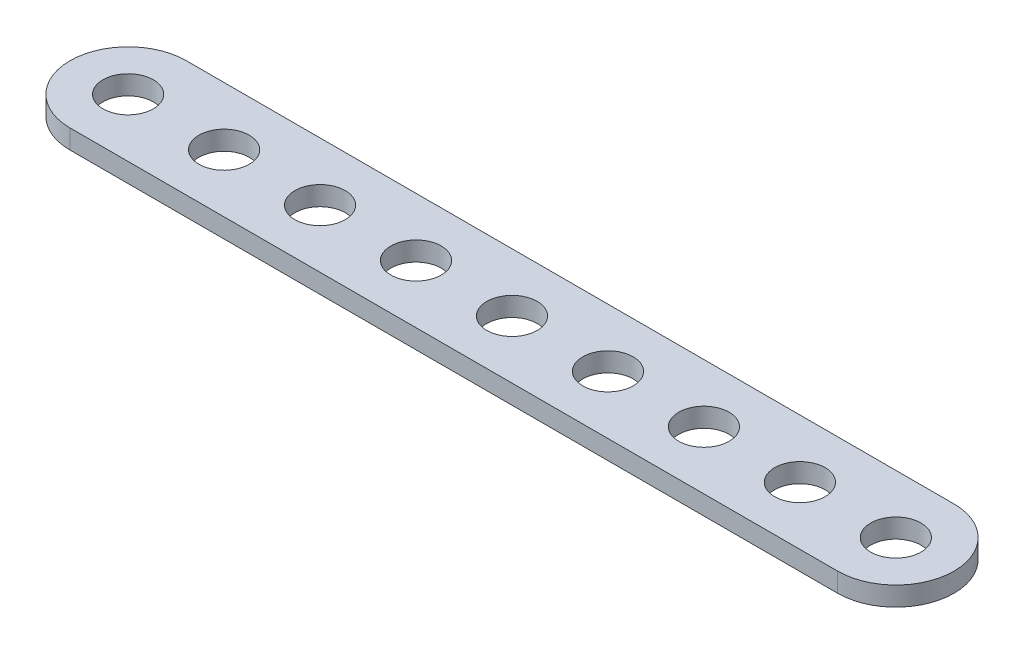
ISO-10303-21;
HEADER;
FILE_DESCRIPTION(('STEP AP214'),'2;1');
FILE_NAME('part.step','',(''),(''),'','','');
FILE_SCHEMA(('AUTOMOTIVE_DESIGN { 1 0 10303 214 1 1 1 1 }'));
ENDSEC;
DATA;
#1=APPLICATION_CONTEXT('core data for automotive mechanical design processes');
#2=APPLICATION_PROTOCOL_DEFINITION('international standard','automotive_design',2000,#1);
#3=PRODUCT_CONTEXT('',#1,'mechanical');
#4=PRODUCT('Part','Part','',(#3));
#5=PRODUCT_RELATED_PRODUCT_CATEGORY('part','',(#4));
#6=PRODUCT_DEFINITION_FORMATION('','',#4);
#7=PRODUCT_DEFINITION_CONTEXT('part definition',#1,'design');
#8=PRODUCT_DEFINITION('design','',#6,#7);
#9=PRODUCT_DEFINITION_SHAPE('','',#8);
#10=(LENGTH_UNIT() NAMED_UNIT(*) SI_UNIT(.MILLI.,.METRE.));
#11=(NAMED_UNIT(*) PLANE_ANGLE_UNIT() SI_UNIT($,.RADIAN.));
#12=(NAMED_UNIT(*) SI_UNIT($,.STERADIAN.) SOLID_ANGLE_UNIT());
#13=UNCERTAINTY_MEASURE_WITH_UNIT(LENGTH_MEASURE(1.E-05),#10,'distance_accuracy_value','');
#14=(GEOMETRIC_REPRESENTATION_CONTEXT(3) GLOBAL_UNCERTAINTY_ASSIGNED_CONTEXT((#13)) GLOBAL_UNIT_ASSIGNED_CONTEXT((#10,
#11,#12)) REPRESENTATION_CONTEXT('',''));
#15=CARTESIAN_POINT('',(0.,0.,0.));
#16=DIRECTION('',(0.,0.,1.));
#17=DIRECTION('',(1.,0.,0.));
#18=AXIS2_PLACEMENT_3D('',#15,#16,#17);
#19=CARTESIAN_POINT('',(0.,0.,0.));
#20=DIRECTION('',(0.,1.,0.));
#21=DIRECTION('',(0.,0.,1.));
#22=AXIS2_PLACEMENT_3D('',#19,#20,#21);
#23=PLANE('',#22);
#24=CARTESIAN_POINT('',(64.,0.,0.));
#25=DIRECTION('',(0.,-1.,0.));
#26=DIRECTION('',(0.,0.,-1.));
#27=AXIS2_PLACEMENT_3D('',#24,#25,#26);
#28=CIRCLE('',#27,4.85);
#29=CARTESIAN_POINT('',(64.,0.,4.85));
#30=VERTEX_POINT('',#29);
#31=CARTESIAN_POINT('',(64.,0.,-4.85));
#32=VERTEX_POINT('',#31);
#33=EDGE_CURVE('E55',#30,#32,#28,.F.);
#34=ORIENTED_EDGE('',*,*,#33,.F.);
#35=DIRECTION('',(-1.,0.,0.));
#36=VECTOR('',#35,1.);
#37=CARTESIAN_POINT('',(0.,0.,4.85));
#38=LINE('',#37,#36);
#39=CARTESIAN_POINT('',(0.,0.,4.85));
#40=VERTEX_POINT('',#39);
#41=EDGE_CURVE('E60',#30,#40,#38,.T.);
#42=ORIENTED_EDGE('',*,*,#41,.T.);
#43=CARTESIAN_POINT('',(0.,0.,0.));
#44=DIRECTION('',(0.,-1.,0.));
#45=DIRECTION('',(0.,0.,-1.));
#46=AXIS2_PLACEMENT_3D('',#43,#44,#45);
#47=CIRCLE('',#46,4.85);
#48=CARTESIAN_POINT('',(0.,0.,-4.85));
#49=VERTEX_POINT('',#48);
#50=EDGE_CURVE('E76',#49,#40,#47,.F.);
#51=ORIENTED_EDGE('',*,*,#50,.F.);
#52=DIRECTION('',(1.,0.,0.));
#53=VECTOR('',#52,1.);
#54=CARTESIAN_POINT('',(0.,0.,-4.85));
#55=LINE('',#54,#53);
#56=EDGE_CURVE('E61',#49,#32,#55,.T.);
#57=ORIENTED_EDGE('',*,*,#56,.T.);
#58=EDGE_LOOP('',(#34,#42,#51,#57));
#59=FACE_BOUND('',#58,.T.);
#60=CARTESIAN_POINT('',(0.,0.,0.));
#61=DIRECTION('',(0.,-1.,0.));
#62=DIRECTION('',(0.,0.,-1.));
#63=AXIS2_PLACEMENT_3D('',#60,#61,#62);
#64=CIRCLE('',#63,2.1);
#65=CARTESIAN_POINT('',(0.,0.,-2.1));
#66=VERTEX_POINT('',#65);
#67=EDGE_CURVE('E64',#66,#66,#64,.F.);
#68=ORIENTED_EDGE('',*,*,#67,.T.);
#69=EDGE_LOOP('',(#68));
#70=FACE_BOUND('',#69,.T.);
#71=CARTESIAN_POINT('',(24.,0.,0.));
#72=DIRECTION('',(0.,-1.,0.));
#73=DIRECTION('',(0.,0.,-1.));
#74=AXIS2_PLACEMENT_3D('',#71,#72,#73);
#75=CIRCLE('',#74,2.1);
#76=CARTESIAN_POINT('',(24.,0.,-2.1));
#77=VERTEX_POINT('',#76);
#78=EDGE_CURVE('E73',#77,#77,#75,.F.);
#79=ORIENTED_EDGE('',*,*,#78,.T.);
#80=EDGE_LOOP('',(#79));
#81=FACE_BOUND('',#80,.T.);
#82=CARTESIAN_POINT('',(8.,0.,0.));
#83=DIRECTION('',(0.,-1.,0.));
#84=DIRECTION('',(0.,0.,-1.));
#85=AXIS2_PLACEMENT_3D('',#82,#83,#84);
#86=CIRCLE('',#85,2.1);
#87=CARTESIAN_POINT('',(8.,0.,-2.1));
#88=VERTEX_POINT('',#87);
#89=EDGE_CURVE('E128',#88,#88,#86,.F.);
#90=ORIENTED_EDGE('',*,*,#89,.T.);
#91=EDGE_LOOP('',(#90));
#92=FACE_BOUND('',#91,.T.);
#93=CARTESIAN_POINT('',(16.,0.,0.));
#94=DIRECTION('',(0.,-1.,0.));
#95=DIRECTION('',(0.,0.,-1.));
#96=AXIS2_PLACEMENT_3D('',#93,#94,#95);
#97=CIRCLE('',#96,2.1);
#98=CARTESIAN_POINT('',(16.,0.,-2.1));
#99=VERTEX_POINT('',#98);
#100=EDGE_CURVE('E121',#99,#99,#97,.F.);
#101=ORIENTED_EDGE('',*,*,#100,.T.);
#102=EDGE_LOOP('',(#101));
#103=FACE_BOUND('',#102,.T.);
#104=CARTESIAN_POINT('',(32.,0.,0.));
#105=DIRECTION('',(0.,-1.,0.));
#106=DIRECTION('',(0.,0.,-1.));
#107=AXIS2_PLACEMENT_3D('',#104,#105,#106);
#108=CIRCLE('',#107,2.1);
#109=CARTESIAN_POINT('',(32.,0.,-2.1));
#110=VERTEX_POINT('',#109);
#111=EDGE_CURVE('E131',#110,#110,#108,.F.);
#112=ORIENTED_EDGE('',*,*,#111,.T.);
#113=EDGE_LOOP('',(#112));
#114=FACE_BOUND('',#113,.T.);
#115=CARTESIAN_POINT('',(40.,0.,0.));
#116=DIRECTION('',(0.,-1.,0.));
#117=DIRECTION('',(0.,0.,-1.));
#118=AXIS2_PLACEMENT_3D('',#115,#116,#117);
#119=CIRCLE('',#118,2.1);
#120=CARTESIAN_POINT('',(40.,0.,-2.1));
#121=VERTEX_POINT('',#120);
#122=EDGE_CURVE('E118',#121,#121,#119,.F.);
#123=ORIENTED_EDGE('',*,*,#122,.T.);
#124=EDGE_LOOP('',(#123));
#125=FACE_BOUND('',#124,.T.);
#126=CARTESIAN_POINT('',(48.,0.,0.));
#127=DIRECTION('',(0.,-1.,0.));
#128=DIRECTION('',(0.,0.,-1.));
#129=AXIS2_PLACEMENT_3D('',#126,#127,#128);
#130=CIRCLE('',#129,2.1);
#131=CARTESIAN_POINT('',(48.,0.,-2.1));
#132=VERTEX_POINT('',#131);
#133=EDGE_CURVE('E133',#132,#132,#130,.F.);
#134=ORIENTED_EDGE('',*,*,#133,.T.);
#135=EDGE_LOOP('',(#134));
#136=FACE_BOUND('',#135,.T.);
#137=CARTESIAN_POINT('',(56.,0.,0.));
#138=DIRECTION('',(0.,-1.,0.));
#139=DIRECTION('',(0.,0.,-1.));
#140=AXIS2_PLACEMENT_3D('',#137,#138,#139);
#141=CIRCLE('',#140,2.1);
#142=CARTESIAN_POINT('',(56.,0.,-2.1));
#143=VERTEX_POINT('',#142);
#144=EDGE_CURVE('E115',#143,#143,#141,.F.);
#145=ORIENTED_EDGE('',*,*,#144,.T.);
#146=EDGE_LOOP('',(#145));
#147=FACE_BOUND('',#146,.T.);
#148=CARTESIAN_POINT('',(64.,0.,0.));
#149=DIRECTION('',(0.,-1.,0.));
#150=DIRECTION('',(0.,0.,-1.));
#151=AXIS2_PLACEMENT_3D('',#148,#149,#150);
#152=CIRCLE('',#151,2.1);
#153=CARTESIAN_POINT('',(64.,0.,-2.1));
#154=VERTEX_POINT('',#153);
#155=EDGE_CURVE('E19',#154,#154,#152,.F.);
#156=ORIENTED_EDGE('',*,*,#155,.T.);
#157=EDGE_LOOP('',(#156));
#158=FACE_BOUND('',#157,.T.);
#159=ADVANCED_FACE('F16',(#59,#70,#81,#92,#103,#114,#125,#136,#147,#158),#23,.F.);
#160=CARTESIAN_POINT('',(64.,1.6,0.));
#161=DIRECTION('',(0.,-1.,0.));
#162=DIRECTION('',(0.,0.,-1.));
#163=AXIS2_PLACEMENT_3D('',#160,#161,#162);
#164=CYLINDRICAL_SURFACE('',#163,2.1);
#165=ORIENTED_EDGE('',*,*,#155,.F.);
#166=EDGE_LOOP('',(#165));
#167=FACE_BOUND('',#166,.T.);
#168=CARTESIAN_POINT('',(64.,1.6,0.));
#169=DIRECTION('',(0.,-1.,0.));
#170=DIRECTION('',(0.,0.,-1.));
#171=AXIS2_PLACEMENT_3D('',#168,#169,#170);
#172=CIRCLE('',#171,2.1);
#173=CARTESIAN_POINT('',(64.,1.6,-2.1));
#174=VERTEX_POINT('',#173);
#175=EDGE_CURVE('E112',#174,#174,#172,.T.);
#176=ORIENTED_EDGE('',*,*,#175,.F.);
#177=EDGE_LOOP('',(#176));
#178=FACE_BOUND('',#177,.T.);
#179=ADVANCED_FACE('F141',(#167,#178),#164,.F.);
#180=CARTESIAN_POINT('',(48.,1.6,0.));
#181=DIRECTION('',(0.,-1.,0.));
#182=DIRECTION('',(0.,0.,-1.));
#183=AXIS2_PLACEMENT_3D('',#180,#181,#182);
#184=CYLINDRICAL_SURFACE('',#183,2.1);
#185=ORIENTED_EDGE('',*,*,#133,.F.);
#186=EDGE_LOOP('',(#185));
#187=FACE_BOUND('',#186,.T.);
#188=CARTESIAN_POINT('',(48.,1.6,0.));
#189=DIRECTION('',(0.,-1.,0.));
#190=DIRECTION('',(0.,0.,-1.));
#191=AXIS2_PLACEMENT_3D('',#188,#189,#190);
#192=CIRCLE('',#191,2.1);
#193=CARTESIAN_POINT('',(48.,1.6,-2.1));
#194=VERTEX_POINT('',#193);
#195=EDGE_CURVE('E109',#194,#194,#192,.T.);
#196=ORIENTED_EDGE('',*,*,#195,.F.);
#197=EDGE_LOOP('',(#196));
#198=FACE_BOUND('',#197,.T.);
#199=ADVANCED_FACE('F144',(#187,#198),#184,.F.);
#200=CARTESIAN_POINT('',(32.,1.6,0.));
#201=DIRECTION('',(0.,-1.,0.));
#202=DIRECTION('',(0.,0.,-1.));
#203=AXIS2_PLACEMENT_3D('',#200,#201,#202);
#204=CYLINDRICAL_SURFACE('',#203,2.1);
#205=ORIENTED_EDGE('',*,*,#111,.F.);
#206=EDGE_LOOP('',(#205));
#207=FACE_BOUND('',#206,.T.);
#208=CARTESIAN_POINT('',(32.,1.6,0.));
#209=DIRECTION('',(0.,-1.,0.));
#210=DIRECTION('',(0.,0.,-1.));
#211=AXIS2_PLACEMENT_3D('',#208,#209,#210);
#212=CIRCLE('',#211,2.1);
#213=CARTESIAN_POINT('',(32.,1.6,-2.1));
#214=VERTEX_POINT('',#213);
#215=EDGE_CURVE('E106',#214,#214,#212,.T.);
#216=ORIENTED_EDGE('',*,*,#215,.F.);
#217=EDGE_LOOP('',(#216));
#218=FACE_BOUND('',#217,.T.);
#219=ADVANCED_FACE('F190',(#207,#218),#204,.F.);
#220=CARTESIAN_POINT('',(8.,1.6,0.));
#221=DIRECTION('',(0.,-1.,0.));
#222=DIRECTION('',(0.,0.,-1.));
#223=AXIS2_PLACEMENT_3D('',#220,#221,#222);
#224=CYLINDRICAL_SURFACE('',#223,2.1);
#225=ORIENTED_EDGE('',*,*,#89,.F.);
#226=EDGE_LOOP('',(#225));
#227=FACE_BOUND('',#226,.T.);
#228=CARTESIAN_POINT('',(8.,1.6,0.));
#229=DIRECTION('',(0.,-1.,0.));
#230=DIRECTION('',(0.,0.,-1.));
#231=AXIS2_PLACEMENT_3D('',#228,#229,#230);
#232=CIRCLE('',#231,2.1);
#233=CARTESIAN_POINT('',(8.,1.6,-2.1));
#234=VERTEX_POINT('',#233);
#235=EDGE_CURVE('E103',#234,#234,#232,.T.);
#236=ORIENTED_EDGE('',*,*,#235,.F.);
#237=EDGE_LOOP('',(#236));
#238=FACE_BOUND('',#237,.T.);
#239=ADVANCED_FACE('F186',(#227,#238),#224,.F.);
#240=CARTESIAN_POINT('',(0.,1.6,0.));
#241=DIRECTION('',(0.,-1.,0.));
#242=DIRECTION('',(0.,0.,-1.));
#243=AXIS2_PLACEMENT_3D('',#240,#241,#242);
#244=CYLINDRICAL_SURFACE('',#243,2.1);
#245=ORIENTED_EDGE('',*,*,#67,.F.);
#246=EDGE_LOOP('',(#245));
#247=FACE_BOUND('',#246,.T.);
#248=CARTESIAN_POINT('',(0.,1.6,0.));
#249=DIRECTION('',(0.,-1.,0.));
#250=DIRECTION('',(0.,0.,-1.));
#251=AXIS2_PLACEMENT_3D('',#248,#249,#250);
#252=CIRCLE('',#251,2.1);
#253=CARTESIAN_POINT('',(0.,1.6,-2.1));
#254=VERTEX_POINT('',#253);
#255=EDGE_CURVE('E100',#254,#254,#252,.T.);
#256=ORIENTED_EDGE('',*,*,#255,.F.);
#257=EDGE_LOOP('',(#256));
#258=FACE_BOUND('',#257,.T.);
#259=ADVANCED_FACE('F183',(#247,#258),#244,.F.);
#260=CARTESIAN_POINT('',(64.,1.6,0.));
#261=DIRECTION('',(0.,-1.,0.));
#262=DIRECTION('',(0.,0.,-1.));
#263=AXIS2_PLACEMENT_3D('',#260,#261,#262);
#264=CYLINDRICAL_SURFACE('',#263,4.85);
#265=ORIENTED_EDGE('',*,*,#33,.T.);
#266=DIRECTION('',(0.,1.,0.));
#267=VECTOR('',#266,1.);
#268=CARTESIAN_POINT('',(64.,1.6,-4.85));
#269=LINE('',#268,#267);
#270=CARTESIAN_POINT('',(64.,1.6,-4.85));
#271=VERTEX_POINT('',#270);
#272=EDGE_CURVE('E83',#32,#271,#269,.T.);
#273=ORIENTED_EDGE('',*,*,#272,.T.);
#274=CARTESIAN_POINT('',(64.,1.6,0.));
#275=DIRECTION('',(0.,-1.,0.));
#276=DIRECTION('',(0.,0.,-1.));
#277=AXIS2_PLACEMENT_3D('',#274,#275,#276);
#278=CIRCLE('',#277,4.85);
#279=CARTESIAN_POINT('',(64.,1.6,4.85));
#280=VERTEX_POINT('',#279);
#281=EDGE_CURVE('E70',#280,#271,#278,.F.);
#282=ORIENTED_EDGE('',*,*,#281,.F.);
#283=DIRECTION('',(0.,1.,0.));
#284=VECTOR('',#283,1.);
#285=CARTESIAN_POINT('',(64.,1.6,4.85));
#286=LINE('',#285,#284);
#287=EDGE_CURVE('E67',#280,#30,#286,.F.);
#288=ORIENTED_EDGE('',*,*,#287,.T.);
#289=EDGE_LOOP('',(#265,#273,#282,#288));
#290=FACE_BOUND('',#289,.T.);
#291=ADVANCED_FACE('F68',(#290),#264,.T.);
#292=CARTESIAN_POINT('',(0.,1.6,-4.85));
#293=DIRECTION('',(0.,0.,1.));
#294=DIRECTION('',(1.,0.,0.));
#295=AXIS2_PLACEMENT_3D('',#292,#293,#294);
#296=PLANE('',#295);
#297=DIRECTION('',(1.,0.,0.));
#298=VECTOR('',#297,1.);
#299=CARTESIAN_POINT('',(0.,1.6,-4.85));
#300=LINE('',#299,#298);
#301=CARTESIAN_POINT('',(0.,1.6,-4.85));
#302=VERTEX_POINT('',#301);
#303=EDGE_CURVE('E98',#271,#302,#300,.F.);
#304=ORIENTED_EDGE('',*,*,#303,.F.);
#305=ORIENTED_EDGE('',*,*,#272,.F.);
#306=ORIENTED_EDGE('',*,*,#56,.F.);
#307=DIRECTION('',(0.,-1.,0.));
#308=VECTOR('',#307,1.);
#309=CARTESIAN_POINT('',(0.,1.6,-4.85));
#310=LINE('',#309,#308);
#311=EDGE_CURVE('E79',#302,#49,#310,.T.);
#312=ORIENTED_EDGE('',*,*,#311,.F.);
#313=EDGE_LOOP('',(#304,#305,#306,#312));
#314=FACE_BOUND('',#313,.T.);
#315=ADVANCED_FACE('F177',(#314),#296,.F.);
#316=CARTESIAN_POINT('',(0.,1.6,0.));
#317=DIRECTION('',(0.,-1.,0.));
#318=DIRECTION('',(0.,0.,-1.));
#319=AXIS2_PLACEMENT_3D('',#316,#317,#318);
#320=CYLINDRICAL_SURFACE('',#319,4.85);
#321=ORIENTED_EDGE('',*,*,#50,.T.);
#322=DIRECTION('',(0.,1.,0.));
#323=VECTOR('',#322,1.);
#324=CARTESIAN_POINT('',(0.,1.6,4.85));
#325=LINE('',#324,#323);
#326=CARTESIAN_POINT('',(0.,1.6,4.85));
#327=VERTEX_POINT('',#326);
#328=EDGE_CURVE('E34',#40,#327,#325,.T.);
#329=ORIENTED_EDGE('',*,*,#328,.T.);
#330=CARTESIAN_POINT('',(0.,1.6,0.));
#331=DIRECTION('',(0.,-1.,0.));
#332=DIRECTION('',(0.,0.,-1.));
#333=AXIS2_PLACEMENT_3D('',#330,#331,#332);
#334=CIRCLE('',#333,4.85);
#335=EDGE_CURVE('E95',#302,#327,#334,.F.);
#336=ORIENTED_EDGE('',*,*,#335,.F.);
#337=ORIENTED_EDGE('',*,*,#311,.T.);
#338=EDGE_LOOP('',(#321,#329,#336,#337));
#339=FACE_BOUND('',#338,.T.);
#340=ADVANCED_FACE('F174',(#339),#320,.T.);
#341=CARTESIAN_POINT('',(0.,1.6,4.85));
#342=DIRECTION('',(0.,0.,-1.));
#343=DIRECTION('',(-1.,0.,0.));
#344=AXIS2_PLACEMENT_3D('',#341,#342,#343);
#345=PLANE('',#344);
#346=DIRECTION('',(1.,0.,0.));
#347=VECTOR('',#346,1.);
#348=CARTESIAN_POINT('',(0.,1.6,4.85));
#349=LINE('',#348,#347);
#350=EDGE_CURVE('E94',#327,#280,#349,.T.);
#351=ORIENTED_EDGE('',*,*,#350,.F.);
#352=ORIENTED_EDGE('',*,*,#328,.F.);
#353=ORIENTED_EDGE('',*,*,#41,.F.);
#354=ORIENTED_EDGE('',*,*,#287,.F.);
#355=EDGE_LOOP('',(#351,#352,#353,#354));
#356=FACE_BOUND('',#355,.T.);
#357=ADVANCED_FACE('F75',(#356),#345,.F.);
#358=CARTESIAN_POINT('',(24.,1.6,0.));
#359=DIRECTION('',(0.,-1.,0.));
#360=DIRECTION('',(0.,0.,-1.));
#361=AXIS2_PLACEMENT_3D('',#358,#359,#360);
#362=CYLINDRICAL_SURFACE('',#361,2.1);
#363=ORIENTED_EDGE('',*,*,#78,.F.);
#364=EDGE_LOOP('',(#363));
#365=FACE_BOUND('',#364,.T.);
#366=CARTESIAN_POINT('',(24.,1.6,0.));
#367=DIRECTION('',(0.,-1.,0.));
#368=DIRECTION('',(0.,0.,-1.));
#369=AXIS2_PLACEMENT_3D('',#366,#367,#368);
#370=CIRCLE('',#369,2.1);
#371=CARTESIAN_POINT('',(24.,1.6,-2.1));
#372=VERTEX_POINT('',#371);
#373=EDGE_CURVE('E91',#372,#372,#370,.T.);
#374=ORIENTED_EDGE('',*,*,#373,.F.);
#375=EDGE_LOOP('',(#374));
#376=FACE_BOUND('',#375,.T.);
#377=ADVANCED_FACE('F167',(#365,#376),#362,.F.);
#378=CARTESIAN_POINT('',(16.,1.6,0.));
#379=DIRECTION('',(0.,-1.,0.));
#380=DIRECTION('',(0.,0.,-1.));
#381=AXIS2_PLACEMENT_3D('',#378,#379,#380);
#382=CYLINDRICAL_SURFACE('',#381,2.1);
#383=ORIENTED_EDGE('',*,*,#100,.F.);
#384=EDGE_LOOP('',(#383));
#385=FACE_BOUND('',#384,.T.);
#386=CARTESIAN_POINT('',(16.,1.6,0.));
#387=DIRECTION('',(0.,-1.,0.));
#388=DIRECTION('',(0.,0.,-1.));
#389=AXIS2_PLACEMENT_3D('',#386,#387,#388);
#390=CIRCLE('',#389,2.1);
#391=CARTESIAN_POINT('',(16.,1.6,-2.1));
#392=VERTEX_POINT('',#391);
#393=EDGE_CURVE('E88',#392,#392,#390,.T.);
#394=ORIENTED_EDGE('',*,*,#393,.F.);
#395=EDGE_LOOP('',(#394));
#396=FACE_BOUND('',#395,.T.);
#397=ADVANCED_FACE('F163',(#385,#396),#382,.F.);
#398=CARTESIAN_POINT('',(40.,1.6,0.));
#399=DIRECTION('',(0.,-1.,0.));
#400=DIRECTION('',(0.,0.,-1.));
#401=AXIS2_PLACEMENT_3D('',#398,#399,#400);
#402=CYLINDRICAL_SURFACE('',#401,2.1);
#403=ORIENTED_EDGE('',*,*,#122,.F.);
#404=EDGE_LOOP('',(#403));
#405=FACE_BOUND('',#404,.T.);
#406=CARTESIAN_POINT('',(40.,1.6,0.));
#407=DIRECTION('',(0.,-1.,0.));
#408=DIRECTION('',(0.,0.,-1.));
#409=AXIS2_PLACEMENT_3D('',#406,#407,#408);
#410=CIRCLE('',#409,2.1);
#411=CARTESIAN_POINT('',(40.,1.6,-2.1));
#412=VERTEX_POINT('',#411);
#413=EDGE_CURVE('E25',#412,#412,#410,.T.);
#414=ORIENTED_EDGE('',*,*,#413,.F.);
#415=EDGE_LOOP('',(#414));
#416=FACE_BOUND('',#415,.T.);
#417=ADVANCED_FACE('F156',(#405,#416),#402,.F.);
#418=CARTESIAN_POINT('',(56.,1.6,0.));
#419=DIRECTION('',(0.,-1.,0.));
#420=DIRECTION('',(0.,0.,-1.));
#421=AXIS2_PLACEMENT_3D('',#418,#419,#420);
#422=CYLINDRICAL_SURFACE('',#421,2.1);
#423=ORIENTED_EDGE('',*,*,#144,.F.);
#424=EDGE_LOOP('',(#423));
#425=FACE_BOUND('',#424,.T.);
#426=CARTESIAN_POINT('',(56.,1.6,0.));
#427=DIRECTION('',(0.,-1.,0.));
#428=DIRECTION('',(0.,0.,-1.));
#429=AXIS2_PLACEMENT_3D('',#426,#427,#428);
#430=CIRCLE('',#429,2.1);
#431=CARTESIAN_POINT('',(56.,1.6,-2.1));
#432=VERTEX_POINT('',#431);
#433=EDGE_CURVE('E9',#432,#432,#430,.T.);
#434=ORIENTED_EDGE('',*,*,#433,.F.);
#435=EDGE_LOOP('',(#434));
#436=FACE_BOUND('',#435,.T.);
#437=ADVANCED_FACE('F149',(#425,#436),#422,.F.);
#438=CARTESIAN_POINT('',(0.,1.6,0.));
#439=DIRECTION('',(0.,1.,0.));
#440=DIRECTION('',(0.,0.,1.));
#441=AXIS2_PLACEMENT_3D('',#438,#439,#440);
#442=PLANE('',#441);
#443=ORIENTED_EDGE('',*,*,#433,.T.);
#444=EDGE_LOOP('',(#443));
#445=FACE_BOUND('',#444,.T.);
#446=ORIENTED_EDGE('',*,*,#413,.T.);
#447=EDGE_LOOP('',(#446));
#448=FACE_BOUND('',#447,.T.);
#449=ORIENTED_EDGE('',*,*,#393,.T.);
#450=EDGE_LOOP('',(#449));
#451=FACE_BOUND('',#450,.T.);
#452=ORIENTED_EDGE('',*,*,#373,.T.);
#453=EDGE_LOOP('',(#452));
#454=FACE_BOUND('',#453,.T.);
#455=ORIENTED_EDGE('',*,*,#335,.T.);
#456=ORIENTED_EDGE('',*,*,#350,.T.);
#457=ORIENTED_EDGE('',*,*,#281,.T.);
#458=ORIENTED_EDGE('',*,*,#303,.T.);
#459=EDGE_LOOP('',(#455,#456,#457,#458));
#460=FACE_BOUND('',#459,.T.);
#461=ORIENTED_EDGE('',*,*,#255,.T.);
#462=EDGE_LOOP('',(#461));
#463=FACE_BOUND('',#462,.T.);
#464=ORIENTED_EDGE('',*,*,#235,.T.);
#465=EDGE_LOOP('',(#464));
#466=FACE_BOUND('',#465,.T.);
#467=ORIENTED_EDGE('',*,*,#215,.T.);
#468=EDGE_LOOP('',(#467));
#469=FACE_BOUND('',#468,.T.);
#470=ORIENTED_EDGE('',*,*,#195,.T.);
#471=EDGE_LOOP('',(#470));
#472=FACE_BOUND('',#471,.T.);
#473=ORIENTED_EDGE('',*,*,#175,.T.);
#474=EDGE_LOOP('',(#473));
#475=FACE_BOUND('',#474,.T.);
#476=ADVANCED_FACE('F147',(#445,#448,#451,#454,#460,#463,#466,#469,#472,#475),#442,.T.);
#477=CLOSED_SHELL('',(#159,#179,#199,#219,#239,#259,#291,#315,#340,#357,#377,#397,#417,#437,#476));
#478=MANIFOLD_SOLID_BREP('B1',#477);
#479=ADVANCED_BREP_SHAPE_REPRESENTATION('',(#18,#478),#14);
#480=SHAPE_DEFINITION_REPRESENTATION(#9,#479);
ENDSEC;
END-ISO-10303-21;
